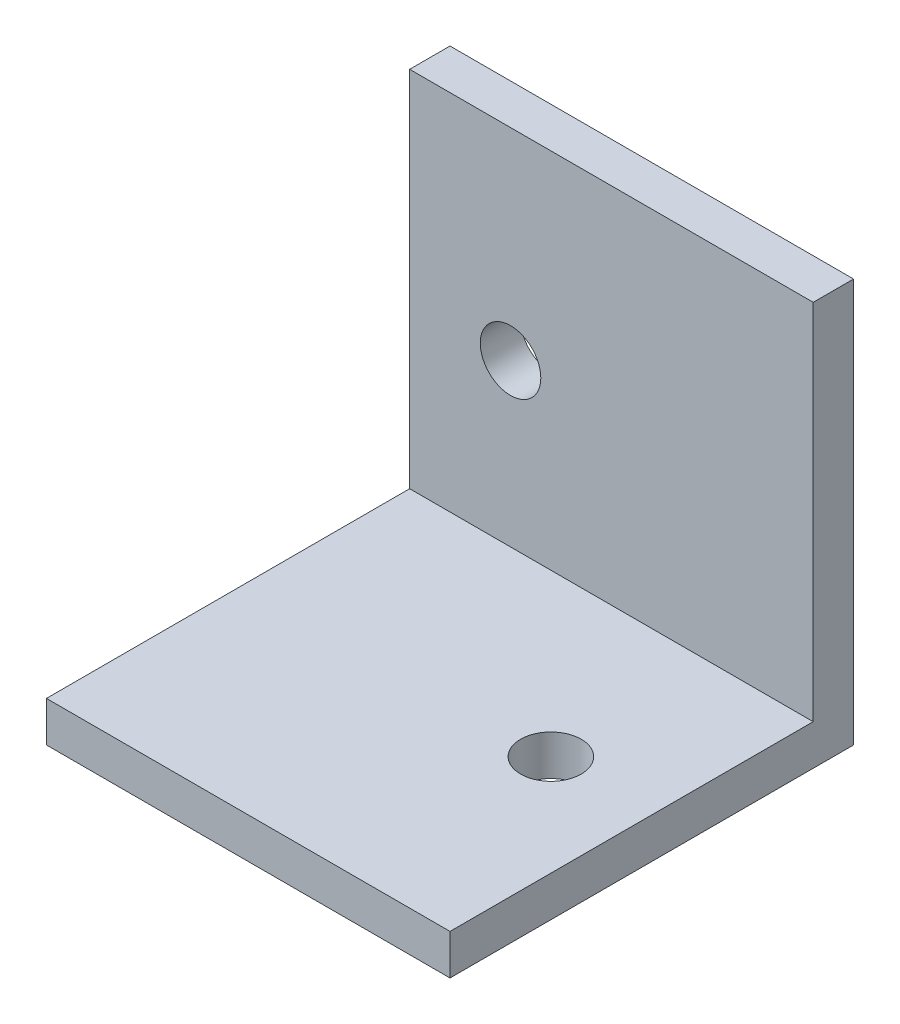
ISO-10303-21;
HEADER;
FILE_DESCRIPTION(('STEP AP214'),'2;1');
FILE_NAME('part.step','',(''),(''),'','','');
FILE_SCHEMA(('AUTOMOTIVE_DESIGN { 1 0 10303 214 1 1 1 1 }'));
ENDSEC;
DATA;
#1=APPLICATION_CONTEXT('core data for automotive mechanical design processes');
#2=APPLICATION_PROTOCOL_DEFINITION('international standard','automotive_design',2000,#1);
#3=PRODUCT_CONTEXT('',#1,'mechanical');
#4=PRODUCT('Part','Part','',(#3));
#5=PRODUCT_RELATED_PRODUCT_CATEGORY('part','',(#4));
#6=PRODUCT_DEFINITION_FORMATION('','',#4);
#7=PRODUCT_DEFINITION_CONTEXT('part definition',#1,'design');
#8=PRODUCT_DEFINITION('design','',#6,#7);
#9=PRODUCT_DEFINITION_SHAPE('','',#8);
#10=(LENGTH_UNIT() NAMED_UNIT(*) SI_UNIT(.MILLI.,.METRE.));
#11=(NAMED_UNIT(*) PLANE_ANGLE_UNIT() SI_UNIT($,.RADIAN.));
#12=(NAMED_UNIT(*) SI_UNIT($,.STERADIAN.) SOLID_ANGLE_UNIT());
#13=UNCERTAINTY_MEASURE_WITH_UNIT(LENGTH_MEASURE(1.E-05),#10,'distance_accuracy_value','');
#14=(GEOMETRIC_REPRESENTATION_CONTEXT(3) GLOBAL_UNCERTAINTY_ASSIGNED_CONTEXT((#13)) GLOBAL_UNIT_ASSIGNED_CONTEXT((#10,
#11,#12)) REPRESENTATION_CONTEXT('',''));
#15=CARTESIAN_POINT('',(0.,0.,0.));
#16=DIRECTION('',(0.,0.,1.));
#17=DIRECTION('',(1.,0.,0.));
#18=AXIS2_PLACEMENT_3D('',#15,#16,#17);
#19=CARTESIAN_POINT('',(9.99999999999999,10.,2.));
#20=DIRECTION('',(-1.,0.,0.));
#21=DIRECTION('',(0.,-1.,0.));
#22=AXIS2_PLACEMENT_3D('',#19,#20,#21);
#23=PLANE('',#22);
#24=DIRECTION('',(0.,1.,0.));
#25=VECTOR('',#24,1.);
#26=CARTESIAN_POINT('',(9.99999999999999,10.,0.));
#27=LINE('',#26,#25);
#28=CARTESIAN_POINT('',(9.99999999999999,-10.,0.));
#29=VERTEX_POINT('',#28);
#30=CARTESIAN_POINT('',(9.99999999999999,10.,0.));
#31=VERTEX_POINT('',#30);
#32=EDGE_CURVE('E95',#29,#31,#27,.T.);
#33=ORIENTED_EDGE('',*,*,#32,.T.);
#34=DIRECTION('',(0.,0.,-1.));
#35=VECTOR('',#34,1.);
#36=CARTESIAN_POINT('',(9.99999999999999,10.,2.));
#37=LINE('',#36,#35);
#38=CARTESIAN_POINT('',(9.99999999999999,10.,2.));
#39=VERTEX_POINT('',#38);
#40=EDGE_CURVE('E11',#39,#31,#37,.T.);
#41=ORIENTED_EDGE('',*,*,#40,.F.);
#42=DIRECTION('',(0.,1.,0.));
#43=VECTOR('',#42,1.);
#44=CARTESIAN_POINT('',(9.99999999999999,10.,2.));
#45=LINE('',#44,#43);
#46=CARTESIAN_POINT('',(9.99999999999999,-8.,2.));
#47=VERTEX_POINT('',#46);
#48=EDGE_CURVE('E88',#47,#39,#45,.T.);
#49=ORIENTED_EDGE('',*,*,#48,.F.);
#50=DIRECTION('',(0.,0.,-1.));
#51=VECTOR('',#50,1.);
#52=CARTESIAN_POINT('',(9.99999999999999,-8.,20.));
#53=LINE('',#52,#51);
#54=CARTESIAN_POINT('',(9.99999999999999,-8.,20.));
#55=VERTEX_POINT('',#54);
#56=EDGE_CURVE('E103',#55,#47,#53,.T.);
#57=ORIENTED_EDGE('',*,*,#56,.F.);
#58=DIRECTION('',(0.,1.,0.));
#59=VECTOR('',#58,1.);
#60=CARTESIAN_POINT('',(9.99999999999999,-10.,20.));
#61=LINE('',#60,#59);
#62=CARTESIAN_POINT('',(9.99999999999999,-10.,20.));
#63=VERTEX_POINT('',#62);
#64=EDGE_CURVE('E98',#63,#55,#61,.T.);
#65=ORIENTED_EDGE('',*,*,#64,.F.);
#66=DIRECTION('',(0.,0.,-1.));
#67=VECTOR('',#66,1.);
#68=CARTESIAN_POINT('',(9.99999999999999,-10.,2.));
#69=LINE('',#68,#67);
#70=EDGE_CURVE('E81',#63,#29,#69,.T.);
#71=ORIENTED_EDGE('',*,*,#70,.T.);
#72=EDGE_LOOP('',(#33,#41,#49,#57,#65,#71));
#73=FACE_BOUND('',#72,.T.);
#74=ADVANCED_FACE('F35',(#73),#23,.F.);
#75=CARTESIAN_POINT('',(-10.,10.,2.));
#76=DIRECTION('',(0.,-1.,0.));
#77=DIRECTION('',(0.,0.,-1.));
#78=AXIS2_PLACEMENT_3D('',#75,#76,#77);
#79=PLANE('',#78);
#80=DIRECTION('',(-1.,0.,0.));
#81=VECTOR('',#80,1.);
#82=CARTESIAN_POINT('',(-10.,10.,0.));
#83=LINE('',#82,#81);
#84=CARTESIAN_POINT('',(-10.,10.,0.));
#85=VERTEX_POINT('',#84);
#86=EDGE_CURVE('E102',#31,#85,#83,.T.);
#87=ORIENTED_EDGE('',*,*,#86,.T.);
#88=DIRECTION('',(0.,0.,-1.));
#89=VECTOR('',#88,1.);
#90=CARTESIAN_POINT('',(-10.,10.,2.));
#91=LINE('',#90,#89);
#92=CARTESIAN_POINT('',(-10.,10.,2.));
#93=VERTEX_POINT('',#92);
#94=EDGE_CURVE('E43',#93,#85,#91,.T.);
#95=ORIENTED_EDGE('',*,*,#94,.F.);
#96=DIRECTION('',(-1.,0.,0.));
#97=VECTOR('',#96,1.);
#98=CARTESIAN_POINT('',(-10.,10.,2.));
#99=LINE('',#98,#97);
#100=EDGE_CURVE('E56',#39,#93,#99,.T.);
#101=ORIENTED_EDGE('',*,*,#100,.F.);
#102=ORIENTED_EDGE('',*,*,#40,.T.);
#103=EDGE_LOOP('',(#87,#95,#101,#102));
#104=FACE_BOUND('',#103,.T.);
#105=ADVANCED_FACE('F120',(#104),#79,.F.);
#106=CARTESIAN_POINT('',(-10.,10.,2.));
#107=DIRECTION('',(1.,0.,0.));
#108=DIRECTION('',(0.,0.,-1.));
#109=AXIS2_PLACEMENT_3D('',#106,#107,#108);
#110=PLANE('',#109);
#111=DIRECTION('',(0.,-1.,0.));
#112=VECTOR('',#111,1.);
#113=CARTESIAN_POINT('',(-10.,10.,0.));
#114=LINE('',#113,#112);
#115=CARTESIAN_POINT('',(-10.,-10.,0.));
#116=VERTEX_POINT('',#115);
#117=EDGE_CURVE('E89',#85,#116,#114,.T.);
#118=ORIENTED_EDGE('',*,*,#117,.T.);
#119=DIRECTION('',(0.,0.,-1.));
#120=VECTOR('',#119,1.);
#121=CARTESIAN_POINT('',(-10.,-10.,2.));
#122=LINE('',#121,#120);
#123=CARTESIAN_POINT('',(-10.,-10.,20.));
#124=VERTEX_POINT('',#123);
#125=EDGE_CURVE('E84',#124,#116,#122,.T.);
#126=ORIENTED_EDGE('',*,*,#125,.F.);
#127=DIRECTION('',(0.,-1.,0.));
#128=VECTOR('',#127,1.);
#129=CARTESIAN_POINT('',(-10.,-10.,20.));
#130=LINE('',#129,#128);
#131=CARTESIAN_POINT('',(-10.,-8.,20.));
#132=VERTEX_POINT('',#131);
#133=EDGE_CURVE('E140',#132,#124,#130,.T.);
#134=ORIENTED_EDGE('',*,*,#133,.F.);
#135=DIRECTION('',(0.,0.,-1.));
#136=VECTOR('',#135,1.);
#137=CARTESIAN_POINT('',(-10.,-8.,20.));
#138=LINE('',#137,#136);
#139=CARTESIAN_POINT('',(-10.,-8.,2.));
#140=VERTEX_POINT('',#139);
#141=EDGE_CURVE('E107',#132,#140,#138,.T.);
#142=ORIENTED_EDGE('',*,*,#141,.T.);
#143=DIRECTION('',(0.,-1.,0.));
#144=VECTOR('',#143,1.);
#145=CARTESIAN_POINT('',(-10.,10.,2.));
#146=LINE('',#145,#144);
#147=EDGE_CURVE('E99',#93,#140,#146,.T.);
#148=ORIENTED_EDGE('',*,*,#147,.F.);
#149=ORIENTED_EDGE('',*,*,#94,.T.);
#150=EDGE_LOOP('',(#118,#126,#134,#142,#148,#149));
#151=FACE_BOUND('',#150,.T.);
#152=ADVANCED_FACE('F117',(#151),#110,.F.);
#153=CARTESIAN_POINT('',(-10.,-10.,2.));
#154=DIRECTION('',(0.,1.,0.));
#155=DIRECTION('',(0.,0.,1.));
#156=AXIS2_PLACEMENT_3D('',#153,#154,#155);
#157=PLANE('',#156);
#158=CARTESIAN_POINT('',(4.99999999999999,-10.,10.));
#159=DIRECTION('',(0.,1.,0.));
#160=DIRECTION('',(0.,0.,1.));
#161=AXIS2_PLACEMENT_3D('',#158,#159,#160);
#162=CIRCLE('',#161,1.5);
#163=CARTESIAN_POINT('',(4.99999999999999,-10.,11.5));
#164=VERTEX_POINT('',#163);
#165=EDGE_CURVE('E152',#164,#164,#162,.T.);
#166=ORIENTED_EDGE('',*,*,#165,.T.);
#167=EDGE_LOOP('',(#166));
#168=FACE_BOUND('',#167,.T.);
#169=DIRECTION('',(1.,0.,0.));
#170=VECTOR('',#169,1.);
#171=CARTESIAN_POINT('',(-10.,-10.,0.));
#172=LINE('',#171,#170);
#173=EDGE_CURVE('E76',#116,#29,#172,.T.);
#174=ORIENTED_EDGE('',*,*,#173,.T.);
#175=ORIENTED_EDGE('',*,*,#70,.F.);
#176=DIRECTION('',(1.,0.,0.));
#177=VECTOR('',#176,1.);
#178=CARTESIAN_POINT('',(-10.,-10.,20.));
#179=LINE('',#178,#177);
#180=EDGE_CURVE('E136',#124,#63,#179,.T.);
#181=ORIENTED_EDGE('',*,*,#180,.F.);
#182=ORIENTED_EDGE('',*,*,#125,.T.);
#183=EDGE_LOOP('',(#174,#175,#181,#182));
#184=FACE_BOUND('',#183,.T.);
#185=ADVANCED_FACE('F78',(#168,#184),#157,.F.);
#186=CARTESIAN_POINT('',(0.,0.,2.));
#187=DIRECTION('',(0.,0.,1.));
#188=DIRECTION('',(1.,0.,0.));
#189=AXIS2_PLACEMENT_3D('',#186,#187,#188);
#190=PLANE('',#189);
#191=CARTESIAN_POINT('',(-5.00000000000001,0.,2.));
#192=DIRECTION('',(0.,0.,1.));
#193=DIRECTION('',(1.,0.,0.));
#194=AXIS2_PLACEMENT_3D('',#191,#192,#193);
#195=CIRCLE('',#194,1.5);
#196=CARTESIAN_POINT('',(-3.50000000000001,0.,2.));
#197=VERTEX_POINT('',#196);
#198=EDGE_CURVE('E149',#197,#197,#195,.T.);
#199=ORIENTED_EDGE('',*,*,#198,.F.);
#200=EDGE_LOOP('',(#199));
#201=FACE_BOUND('',#200,.T.);
#202=DIRECTION('',(-1.,0.,0.));
#203=VECTOR('',#202,1.);
#204=CARTESIAN_POINT('',(-10.,-8.,2.));
#205=LINE('',#204,#203);
#206=EDGE_CURVE('E50',#47,#140,#205,.T.);
#207=ORIENTED_EDGE('',*,*,#206,.F.);
#208=ORIENTED_EDGE('',*,*,#48,.T.);
#209=ORIENTED_EDGE('',*,*,#100,.T.);
#210=ORIENTED_EDGE('',*,*,#147,.T.);
#211=EDGE_LOOP('',(#207,#208,#209,#210));
#212=FACE_BOUND('',#211,.T.);
#213=ADVANCED_FACE('F141',(#201,#212),#190,.T.);
#214=CARTESIAN_POINT('',(0.,0.,0.));
#215=DIRECTION('',(0.,0.,1.));
#216=DIRECTION('',(1.,0.,0.));
#217=AXIS2_PLACEMENT_3D('',#214,#215,#216);
#218=PLANE('',#217);
#219=CARTESIAN_POINT('',(-5.00000000000001,0.,0.));
#220=DIRECTION('',(0.,0.,1.));
#221=DIRECTION('',(1.,0.,0.));
#222=AXIS2_PLACEMENT_3D('',#219,#220,#221);
#223=CIRCLE('',#222,1.5);
#224=CARTESIAN_POINT('',(-3.50000000000001,0.,0.));
#225=VERTEX_POINT('',#224);
#226=EDGE_CURVE('E38',#225,#225,#223,.T.);
#227=ORIENTED_EDGE('',*,*,#226,.T.);
#228=EDGE_LOOP('',(#227));
#229=FACE_BOUND('',#228,.T.);
#230=ORIENTED_EDGE('',*,*,#32,.F.);
#231=ORIENTED_EDGE('',*,*,#173,.F.);
#232=ORIENTED_EDGE('',*,*,#117,.F.);
#233=ORIENTED_EDGE('',*,*,#86,.F.);
#234=EDGE_LOOP('',(#230,#231,#232,#233));
#235=FACE_BOUND('',#234,.T.);
#236=ADVANCED_FACE('F101',(#229,#235),#218,.F.);
#237=CARTESIAN_POINT('',(-10.,-8.,20.));
#238=DIRECTION('',(0.,-1.,0.));
#239=DIRECTION('',(0.,0.,-1.));
#240=AXIS2_PLACEMENT_3D('',#237,#238,#239);
#241=PLANE('',#240);
#242=CARTESIAN_POINT('',(4.99999999999999,-8.,10.));
#243=DIRECTION('',(0.,1.,0.));
#244=DIRECTION('',(0.,0.,1.));
#245=AXIS2_PLACEMENT_3D('',#242,#243,#244);
#246=CIRCLE('',#245,1.5);
#247=CARTESIAN_POINT('',(4.99999999999999,-8.,11.5));
#248=VERTEX_POINT('',#247);
#249=EDGE_CURVE('E155',#248,#248,#246,.T.);
#250=ORIENTED_EDGE('',*,*,#249,.F.);
#251=EDGE_LOOP('',(#250));
#252=FACE_BOUND('',#251,.T.);
#253=ORIENTED_EDGE('',*,*,#206,.T.);
#254=ORIENTED_EDGE('',*,*,#141,.F.);
#255=DIRECTION('',(-1.,0.,0.));
#256=VECTOR('',#255,1.);
#257=CARTESIAN_POINT('',(-10.,-8.,20.));
#258=LINE('',#257,#256);
#259=EDGE_CURVE('E129',#55,#132,#258,.T.);
#260=ORIENTED_EDGE('',*,*,#259,.F.);
#261=ORIENTED_EDGE('',*,*,#56,.T.);
#262=EDGE_LOOP('',(#253,#254,#260,#261));
#263=FACE_BOUND('',#262,.T.);
#264=ADVANCED_FACE('F125',(#252,#263),#241,.F.);
#265=CARTESIAN_POINT('',(0.,0.,20.));
#266=DIRECTION('',(0.,0.,-1.));
#267=DIRECTION('',(-1.,0.,0.));
#268=AXIS2_PLACEMENT_3D('',#265,#266,#267);
#269=PLANE('',#268);
#270=ORIENTED_EDGE('',*,*,#133,.T.);
#271=ORIENTED_EDGE('',*,*,#180,.T.);
#272=ORIENTED_EDGE('',*,*,#64,.T.);
#273=ORIENTED_EDGE('',*,*,#259,.T.);
#274=EDGE_LOOP('',(#270,#271,#272,#273));
#275=FACE_BOUND('',#274,.T.);
#276=ADVANCED_FACE('F146',(#275),#269,.F.);
#277=CARTESIAN_POINT('',(-5.00000000000001,0.,-8.));
#278=DIRECTION('',(0.,0.,1.));
#279=DIRECTION('',(1.,0.,0.));
#280=AXIS2_PLACEMENT_3D('',#277,#278,#279);
#281=CYLINDRICAL_SURFACE('',#280,1.5);
#282=ORIENTED_EDGE('',*,*,#198,.T.);
#283=EDGE_LOOP('',(#282));
#284=FACE_BOUND('',#283,.T.);
#285=ORIENTED_EDGE('',*,*,#226,.F.);
#286=EDGE_LOOP('',(#285));
#287=FACE_BOUND('',#286,.T.);
#288=ADVANCED_FACE('F168',(#284,#287),#281,.F.);
#289=CARTESIAN_POINT('',(4.99999999999999,-18.,10.));
#290=DIRECTION('',(0.,1.,0.));
#291=DIRECTION('',(0.,0.,1.));
#292=AXIS2_PLACEMENT_3D('',#289,#290,#291);
#293=CYLINDRICAL_SURFACE('',#292,1.5);
#294=ORIENTED_EDGE('',*,*,#249,.T.);
#295=EDGE_LOOP('',(#294));
#296=FACE_BOUND('',#295,.T.);
#297=ORIENTED_EDGE('',*,*,#165,.F.);
#298=EDGE_LOOP('',(#297));
#299=FACE_BOUND('',#298,.T.);
#300=ADVANCED_FACE('F159',(#296,#299),#293,.F.);
#301=CLOSED_SHELL('',(#74,#105,#152,#185,#213,#236,#264,#276,#288,#300));
#302=MANIFOLD_SOLID_BREP('B2',#301);
#303=ADVANCED_BREP_SHAPE_REPRESENTATION('',(#18,#302),#14);
#304=SHAPE_DEFINITION_REPRESENTATION(#9,#303);
ENDSEC;
END-ISO-10303-21;
